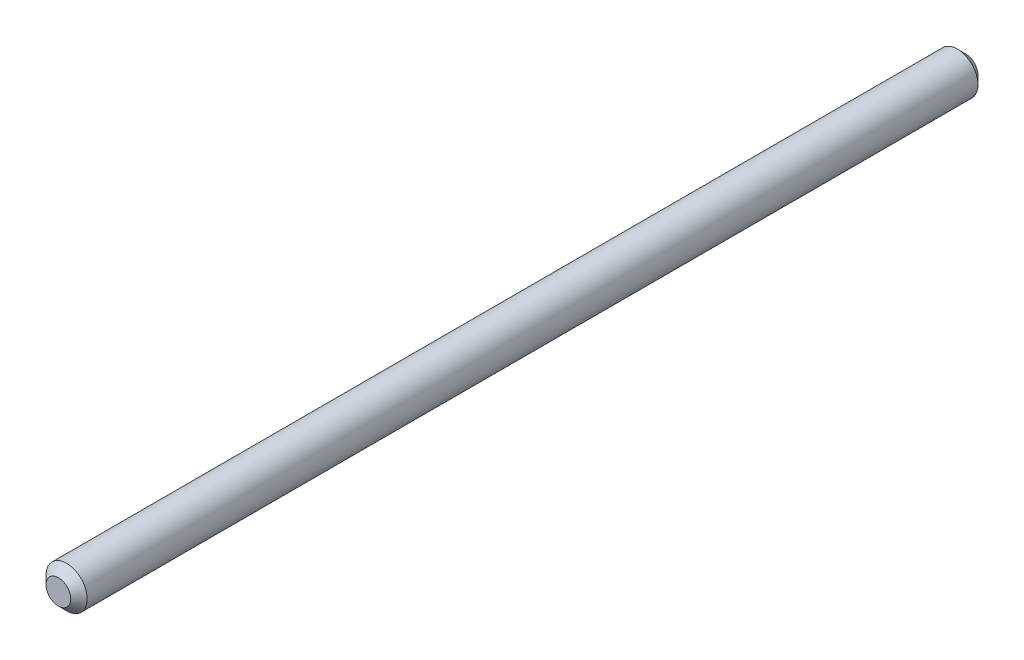
ISO-10303-21;
HEADER;
FILE_DESCRIPTION(('STEP AP214'),'2;1');
FILE_NAME('part.step','',(''),(''),'','','');
FILE_SCHEMA(('AUTOMOTIVE_DESIGN { 1 0 10303 214 1 1 1 1 }'));
ENDSEC;
DATA;
#1=APPLICATION_CONTEXT('core data for automotive mechanical design processes');
#2=APPLICATION_PROTOCOL_DEFINITION('international standard','automotive_design',2000,#1);
#3=PRODUCT_CONTEXT('',#1,'mechanical');
#4=PRODUCT('Part','Part','',(#3));
#5=PRODUCT_RELATED_PRODUCT_CATEGORY('part','',(#4));
#6=PRODUCT_DEFINITION_FORMATION('','',#4);
#7=PRODUCT_DEFINITION_CONTEXT('part definition',#1,'design');
#8=PRODUCT_DEFINITION('design','',#6,#7);
#9=PRODUCT_DEFINITION_SHAPE('','',#8);
#10=(LENGTH_UNIT() NAMED_UNIT(*) SI_UNIT(.MILLI.,.METRE.));
#11=(NAMED_UNIT(*) PLANE_ANGLE_UNIT() SI_UNIT($,.RADIAN.));
#12=(NAMED_UNIT(*) SI_UNIT($,.STERADIAN.) SOLID_ANGLE_UNIT());
#13=UNCERTAINTY_MEASURE_WITH_UNIT(LENGTH_MEASURE(1.E-05),#10,'distance_accuracy_value','');
#14=(GEOMETRIC_REPRESENTATION_CONTEXT(3) GLOBAL_UNCERTAINTY_ASSIGNED_CONTEXT((#13)) GLOBAL_UNIT_ASSIGNED_CONTEXT((#10,
#11,#12)) REPRESENTATION_CONTEXT('',''));
#15=CARTESIAN_POINT('',(0.,0.,0.));
#16=DIRECTION('',(0.,0.,1.));
#17=DIRECTION('',(1.,0.,0.));
#18=AXIS2_PLACEMENT_3D('',#15,#16,#17);
#19=CARTESIAN_POINT('',(0.,0.,0.));
#20=DIRECTION('',(0.,0.,1.));
#21=DIRECTION('',(1.,0.,0.));
#22=AXIS2_PLACEMENT_3D('',#19,#20,#21);
#23=PLANE('',#22);
#24=CARTESIAN_POINT('',(0.,0.,0.));
#25=DIRECTION('',(0.,0.,1.));
#26=DIRECTION('',(1.,0.,0.));
#27=AXIS2_PLACEMENT_3D('',#24,#25,#26);
#28=CIRCLE('',#27,0.449985298928368);
#29=CARTESIAN_POINT('',(0.449985298928368,0.,0.));
#30=VERTEX_POINT('',#29);
#31=EDGE_CURVE('E18',#30,#30,#28,.T.);
#32=ORIENTED_EDGE('',*,*,#31,.F.);
#33=EDGE_LOOP('',(#32));
#34=FACE_BOUND('',#33,.T.);
#35=ADVANCED_FACE('F15',(#34),#23,.F.);
#36=CARTESIAN_POINT('',(0.,0.,33.));
#37=DIRECTION('',(0.,0.,1.));
#38=DIRECTION('',(1.,0.,0.));
#39=AXIS2_PLACEMENT_3D('',#36,#37,#38);
#40=PLANE('',#39);
#41=CARTESIAN_POINT('',(0.,0.,32.9999999999586));
#42=DIRECTION('',(0.,0.,-1.));
#43=DIRECTION('',(-1.,0.,0.));
#44=AXIS2_PLACEMENT_3D('',#41,#42,#43);
#45=CIRCLE('',#44,0.449985298928368);
#46=CARTESIAN_POINT('',(-0.449985298928368,0.,32.9999999999586));
#47=VERTEX_POINT('',#46);
#48=EDGE_CURVE('E27',#47,#47,#45,.T.);
#49=ORIENTED_EDGE('',*,*,#48,.F.);
#50=EDGE_LOOP('',(#49));
#51=FACE_BOUND('',#50,.T.);
#52=ADVANCED_FACE('F38',(#51),#40,.T.);
#53=CARTESIAN_POINT('',(0.,0.,0.300024502507767));
#54=DIRECTION('',(0.,0.,1.));
#55=DIRECTION('',(1.,0.,0.));
#56=AXIS2_PLACEMENT_3D('',#53,#54,#55);
#57=CONICAL_SURFACE('',#56,0.749999999868578,0.785381828518826);
#58=CARTESIAN_POINT('',(0.,0.,0.300024502613125));
#59=DIRECTION('',(0.,0.,1.));
#60=DIRECTION('',(1.,0.,0.));
#61=AXIS2_PLACEMENT_3D('',#58,#59,#60);
#62=CIRCLE('',#61,0.75);
#63=CARTESIAN_POINT('',(0.75,0.,0.300024502613125));
#64=VERTEX_POINT('',#63);
#65=EDGE_CURVE('E22',#64,#64,#62,.T.);
#66=ORIENTED_EDGE('',*,*,#65,.F.);
#67=EDGE_LOOP('',(#66));
#68=FACE_BOUND('',#67,.T.);
#69=ORIENTED_EDGE('',*,*,#31,.T.);
#70=EDGE_LOOP('',(#69));
#71=FACE_BOUND('',#70,.T.);
#72=ADVANCED_FACE('F35',(#68,#71),#57,.T.);
#73=CARTESIAN_POINT('',(0.,0.,32.699975497394));
#74=DIRECTION('',(0.,0.,-1.));
#75=DIRECTION('',(-1.,0.,0.));
#76=AXIS2_PLACEMENT_3D('',#73,#74,#75);
#77=CONICAL_SURFACE('',#76,0.749999999925421,0.78538182851883);
#78=CARTESIAN_POINT('',(0.,0.,32.6999754973455));
#79=DIRECTION('',(0.,0.,1.));
#80=DIRECTION('',(1.,0.,0.));
#81=AXIS2_PLACEMENT_3D('',#78,#79,#80);
#82=CIRCLE('',#81,0.75);
#83=CARTESIAN_POINT('',(0.75,0.,32.6999754973455));
#84=VERTEX_POINT('',#83);
#85=EDGE_CURVE('E10',#84,#84,#82,.F.);
#86=ORIENTED_EDGE('',*,*,#85,.F.);
#87=EDGE_LOOP('',(#86));
#88=FACE_BOUND('',#87,.T.);
#89=ORIENTED_EDGE('',*,*,#48,.T.);
#90=EDGE_LOOP('',(#89));
#91=FACE_BOUND('',#90,.T.);
#92=ADVANCED_FACE('F46',(#88,#91),#77,.T.);
#93=CARTESIAN_POINT('',(0.,0.,0.));
#94=DIRECTION('',(0.,0.,1.));
#95=DIRECTION('',(1.,0.,0.));
#96=AXIS2_PLACEMENT_3D('',#93,#94,#95);
#97=CYLINDRICAL_SURFACE('',#96,0.75);
#98=ORIENTED_EDGE('',*,*,#85,.T.);
#99=EDGE_LOOP('',(#98));
#100=FACE_BOUND('',#99,.T.);
#101=ORIENTED_EDGE('',*,*,#65,.T.);
#102=EDGE_LOOP('',(#101));
#103=FACE_BOUND('',#102,.T.);
#104=ADVANCED_FACE('F44',(#100,#103),#97,.T.);
#105=CLOSED_SHELL('',(#35,#52,#72,#92,#104));
#106=MANIFOLD_SOLID_BREP('B1',#105);
#107=ADVANCED_BREP_SHAPE_REPRESENTATION('',(#18,#106),#14);
#108=SHAPE_DEFINITION_REPRESENTATION(#9,#107);
ENDSEC;
END-ISO-10303-21;
